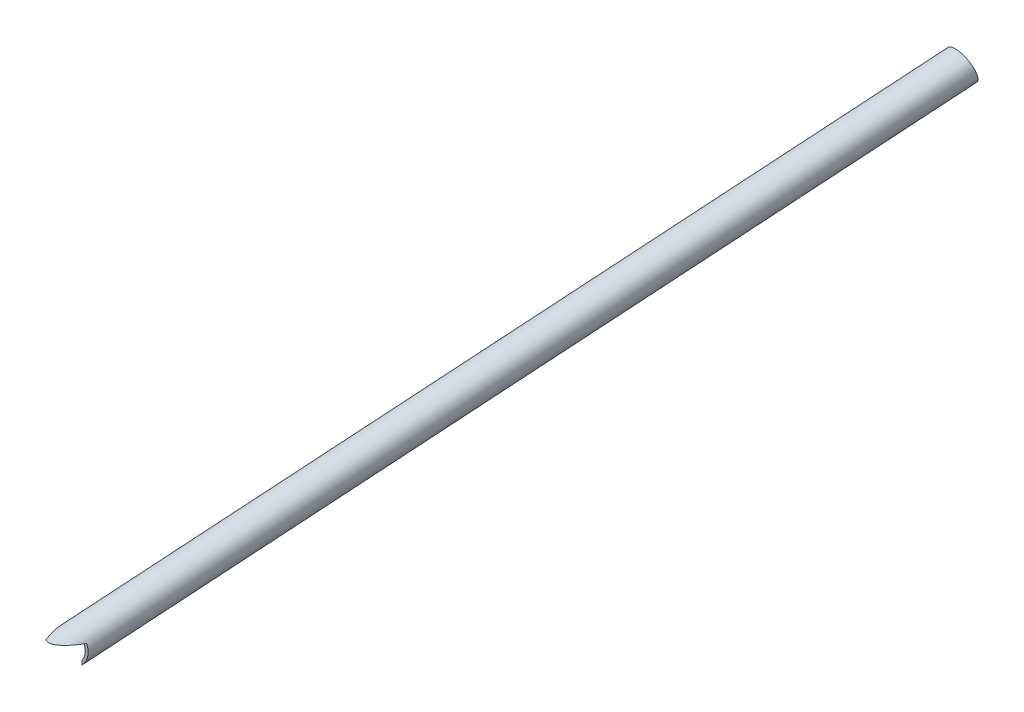
ISO-10303-21;
HEADER;
FILE_DESCRIPTION(('STEP AP214'),'2;1');
FILE_NAME('part.step','',(''),(''),'','','');
FILE_SCHEMA(('AUTOMOTIVE_DESIGN { 1 0 10303 214 1 1 1 1 }'));
ENDSEC;
DATA;
#1=APPLICATION_CONTEXT('core data for automotive mechanical design processes');
#2=APPLICATION_PROTOCOL_DEFINITION('international standard','automotive_design',2000,#1);
#3=PRODUCT_CONTEXT('',#1,'mechanical');
#4=PRODUCT('Part','Part','',(#3));
#5=PRODUCT_RELATED_PRODUCT_CATEGORY('part','',(#4));
#6=PRODUCT_DEFINITION_FORMATION('','',#4);
#7=PRODUCT_DEFINITION_CONTEXT('part definition',#1,'design');
#8=PRODUCT_DEFINITION('design','',#6,#7);
#9=PRODUCT_DEFINITION_SHAPE('','',#8);
#10=(LENGTH_UNIT() NAMED_UNIT(*) SI_UNIT(.MILLI.,.METRE.));
#11=(NAMED_UNIT(*) PLANE_ANGLE_UNIT() SI_UNIT($,.RADIAN.));
#12=(NAMED_UNIT(*) SI_UNIT($,.STERADIAN.) SOLID_ANGLE_UNIT());
#13=UNCERTAINTY_MEASURE_WITH_UNIT(LENGTH_MEASURE(1.E-05),#10,'distance_accuracy_value','');
#14=(GEOMETRIC_REPRESENTATION_CONTEXT(3) GLOBAL_UNCERTAINTY_ASSIGNED_CONTEXT((#13)) GLOBAL_UNIT_ASSIGNED_CONTEXT((#10,
#11,#12)) REPRESENTATION_CONTEXT('',''));
#15=CARTESIAN_POINT('',(0.,0.,0.));
#16=DIRECTION('',(0.,0.,1.));
#17=DIRECTION('',(1.,0.,0.));
#18=AXIS2_PLACEMENT_3D('',#15,#16,#17);
#19=CARTESIAN_POINT('',(-225.,200.,-200.));
#20=DIRECTION('',(0.313257210262409,0.388871019636094,-0.866400167535647));
#21=DIRECTION('',(0.,0.912318699307092,0.409480879766828));
#22=AXIS2_PLACEMENT_3D('',#19,#20,#21);
#23=CYLINDRICAL_SURFACE('',#22,7.9);
#24=CARTESIAN_POINT('',(-221.38438192881,204.488353467684,-210.));
#25=DIRECTION('',(0.,0.,1.));
#26=DIRECTION('',(0.627329537872645,0.778753909083283,0.));
#27=AXIS2_PLACEMENT_3D('',#24,#25,#26);
#28=ELLIPSE('',#27,9.11818844919022,7.9);
#29=CARTESIAN_POINT('',(-215.,199.831593159286,-210.));
#30=VERTEX_POINT('',#29);
#31=CARTESIAN_POINT('',(-214.223926995827,210.,-210.));
#32=VERTEX_POINT('',#31);
#33=EDGE_CURVE('E87',#30,#32,#28,.T.);
#34=ORIENTED_EDGE('',*,*,#33,.T.);
#35=CARTESIAN_POINT('',(-216.944444444444,210.,-222.279885200662));
#36=DIRECTION('',(0.,-1.,0.));
#37=DIRECTION('',(0.340019385805579,0.,-0.940418426699731));
#38=AXIS2_PLACEMENT_3D('',#35,#36,#37);
#39=ELLIPSE('',#38,20.3152191885958,7.9);
#40=CARTESIAN_POINT('',(-224.420881433489,210.,-203.449159749219));
#41=VERTEX_POINT('',#40);
#42=EDGE_CURVE('E58',#32,#41,#39,.T.);
#43=ORIENTED_EDGE('',*,*,#42,.T.);
#44=CARTESIAN_POINT('',(-223.15741407585,209.494665768298,-201.861286232763));
#45=CARTESIAN_POINT('',(-223.327974406081,209.562745738719,-202.012969265239));
#46=CARTESIAN_POINT('',(-223.488905143782,209.626944427415,-202.177273133402));
#47=CARTESIAN_POINT('',(-223.791864856838,209.748128840365,-202.525052642487));
#48=CARTESIAN_POINT('',(-223.933860733492,209.805101925764,-202.708560879475));
#49=CARTESIAN_POINT('',(-224.202084198849,209.912660789028,-203.090884440588));
#50=CARTESIAN_POINT('',(-224.328162850766,209.963186278447,-203.289819713302));
#51=CARTESIAN_POINT('',(-224.565793241595,210.057555962606,-203.697481360151));
#52=CARTESIAN_POINT('',(-224.677350123723,210.101402523783,-203.906204231962));
#53=CARTESIAN_POINT('',(-224.874517210087,210.17718743194,-204.302545574563));
#54=CARTESIAN_POINT('',(-224.961605595777,210.209933928598,-204.489284420906));
#55=CARTESIAN_POINT('',(-225.128243197558,210.270535558479,-204.866902084952));
#56=CARTESIAN_POINT('',(-225.207790896655,210.298389708443,-205.057781726226));
#57=CARTESIAN_POINT('',(-225.360531873015,210.349143618943,-205.44286743212));
#58=CARTESIAN_POINT('',(-225.433720346823,210.372039653504,-205.637075880849));
#59=CARTESIAN_POINT('',(-225.574605255814,210.412713683802,-206.028021785199));
#60=CARTESIAN_POINT('',(-225.642301057944,210.430491090198,-206.224759529311));
#61=CARTESIAN_POINT('',(-225.772850161109,210.460708569582,-206.620005490419));
#62=CARTESIAN_POINT('',(-225.83570849124,210.473154248712,-206.818511622636));
#63=CARTESIAN_POINT('',(-225.957233671713,210.492479216565,-207.217087974702));
#64=CARTESIAN_POINT('',(-226.01590016514,210.499358031809,-207.417158326133));
#65=CARTESIAN_POINT('',(-226.129437059783,210.507229691773,-207.81834829092));
#66=CARTESIAN_POINT('',(-226.184309936347,210.508226411098,-208.019467126208));
#67=CARTESIAN_POINT('',(-226.290629477458,210.503965117743,-208.42254371347));
#68=CARTESIAN_POINT('',(-226.342076037763,210.498706914856,-208.624501490769));
#69=CARTESIAN_POINT('',(-226.470812913115,210.476486415748,-209.146644744409));
#70=CARTESIAN_POINT('',(-226.545717299132,210.454493283931,-209.467228016284));
#71=CARTESIAN_POINT('',(-226.688135576776,210.391581478762,-210.108293160778));
#72=CARTESIAN_POINT('',(-226.755647653678,210.350658171095,-210.428774989328));
#73=CARTESIAN_POINT('',(-226.88318551129,210.247236082529,-211.066882200823));
#74=CARTESIAN_POINT('',(-226.943231403712,210.184797050782,-211.384513020718));
#75=CARTESIAN_POINT('',(-227.055662251596,210.034838645641,-212.015052089754));
#76=CARTESIAN_POINT('',(-227.108052412334,209.947336434132,-212.327963416731));
#77=CARTESIAN_POINT('',(-227.209205057179,209.732557526454,-212.976540123217));
#78=CARTESIAN_POINT('',(-227.257077223593,209.602172654149,-213.311341482179));
#79=CARTESIAN_POINT('',(-227.340526705393,209.298490783353,-213.96287870284));
#80=CARTESIAN_POINT('',(-227.376113972755,209.125228715901,-214.279629013146));
#81=CARTESIAN_POINT('',(-227.426142429048,208.769190109272,-214.819992523545));
#82=CARTESIAN_POINT('',(-227.443425831851,208.595680174492,-215.049371487169));
#83=CARTESIAN_POINT('',(-227.466260169275,208.21453962706,-215.478540418481));
#84=CARTESIAN_POINT('',(-227.471830524033,208.006966108684,-215.678378851741));
#85=CARTESIAN_POINT('',(-227.469678155462,207.59520199112,-216.008068509465));
#86=CARTESIAN_POINT('',(-227.463961777122,207.395905664675,-216.144012669458));
#87=CARTESIAN_POINT('',(-227.442562987403,206.978001992038,-216.38094169408));
#88=CARTESIAN_POINT('',(-227.426886380901,206.759405957675,-216.481946868424));
#89=CARTESIAN_POINT('',(-227.385919417368,206.309215765552,-216.645468005782));
#90=CARTESIAN_POINT('',(-227.360631160439,206.077624456615,-216.707992368865));
#91=CARTESIAN_POINT('',(-227.30157913635,205.608465167779,-216.79491824006));
#92=CARTESIAN_POINT('',(-227.267808448194,205.370892450642,-216.819288499405));
#93=CARTESIAN_POINT('',(-227.181282950598,204.819367462172,-216.835431093189));
#94=CARTESIAN_POINT('',(-227.125917576665,204.505476752567,-216.814165422459));
#95=CARTESIAN_POINT('',(-227.006237331831,203.886845601141,-216.722053584703));
#96=CARTESIAN_POINT('',(-226.941904338121,203.582125247281,-216.65110581589));
#97=CARTESIAN_POINT('',(-226.821041889938,203.049412135,-216.489738247));
#98=CARTESIAN_POINT('',(-226.765744490888,202.818835077272,-216.406622524923));
#99=CARTESIAN_POINT('',(-226.651774852837,202.36653896789,-216.220671171659));
#100=CARTESIAN_POINT('',(-226.593100571977,202.144825415872,-216.117823519814));
#101=CARTESIAN_POINT('',(-226.472751037479,201.710063822549,-215.895720879295));
#102=CARTESIAN_POINT('',(-226.411069469615,201.497035904644,-215.776430315131));
#103=CARTESIAN_POINT('',(-226.28504974538,201.079888985208,-215.524334572306));
#104=CARTESIAN_POINT('',(-226.220710623903,200.875773276549,-215.391524457837));
#105=CARTESIAN_POINT('',(-226.096880062015,200.498775780657,-215.130224660584));
#106=CARTESIAN_POINT('',(-226.037659740033,200.324966864671,-215.002935620688));
#107=CARTESIAN_POINT('',(-225.917163241838,199.983957879284,-214.740667265254));
#108=CARTESIAN_POINT('',(-225.855886743686,199.816758853821,-214.605686743108));
#109=CARTESIAN_POINT('',(-225.731130251102,199.48869541074,-214.328974776711));
#110=CARTESIAN_POINT('',(-225.667648744281,199.32783550917,-214.187238673058));
#111=CARTESIAN_POINT('',(-225.538320412779,199.012401106471,-213.897935161772));
#112=CARTESIAN_POINT('',(-225.472473273087,198.857827448312,-213.75036697727));
#113=CARTESIAN_POINT('',(-225.338141714108,198.554888492324,-213.450141487032));
#114=CARTESIAN_POINT('',(-225.269657204778,198.406523406829,-213.297484007564));
#115=CARTESIAN_POINT('',(-225.129686954206,198.115998592107,-212.987741281181));
#116=CARTESIAN_POINT('',(-225.058201525117,197.973838220594,-212.830656495346));
#117=CARTESIAN_POINT('',(-224.911778713593,197.69585221722,-212.51271795481));
#118=CARTESIAN_POINT('',(-224.83684334535,197.560022979961,-212.351866425553));
#119=CARTESIAN_POINT('',(-224.682866587882,197.294805557343,-212.026877908535));
#120=CARTESIAN_POINT('',(-224.603825600433,197.165416744143,-211.86274124322));
#121=CARTESIAN_POINT('',(-224.436786061511,196.907129602942,-211.523498171585));
#122=CARTESIAN_POINT('',(-224.348537543981,196.778575417702,-211.348252067001));
#123=CARTESIAN_POINT('',(-224.16548454257,196.529560758505,-210.995483522681));
#124=CARTESIAN_POINT('',(-224.070681338234,196.409098713877,-210.817961532701));
#125=CARTESIAN_POINT('',(-223.873085464909,196.177293680949,-210.461571387701));
#126=CARTESIAN_POINT('',(-223.770297792094,196.065945078209,-210.282704136752));
#127=CARTESIAN_POINT('',(-223.554863184149,195.853772251427,-209.924640484168));
#128=CARTESIAN_POINT('',(-223.442218498164,195.75294563796,-209.745444166708));
#129=CARTESIAN_POINT('',(-223.234626401174,195.587660603325,-209.432985571822));
#130=CARTESIAN_POINT('',(-223.142308980557,195.52041690198,-209.299455405871));
#131=CARTESIAN_POINT('',(-222.949943619699,195.3943239469,-209.033943945666));
#132=CARTESIAN_POINT('',(-222.849895474167,195.335474916205,-208.901962692652));
#133=CARTESIAN_POINT('',(-222.641443975575,195.227862081538,-208.640995227644));
#134=CARTESIAN_POINT('',(-222.533060294659,195.179075475351,-208.512002845316));
#135=CARTESIAN_POINT('',(-222.307186863994,195.093255768318,-208.258126637429));
#136=CARTESIAN_POINT('',(-222.189700347238,195.056218518124,-208.133241375415));
#137=CARTESIAN_POINT('',(-221.971439645239,195.002174997219,-207.914922414697));
#138=CARTESIAN_POINT('',(-221.872375764756,194.982590324942,-207.820416326994));
#139=CARTESIAN_POINT('',(-221.669003103014,194.952755953879,-207.63568451151));
#140=CARTESIAN_POINT('',(-221.564695576393,194.942504033175,-207.545457769765));
#141=CARTESIAN_POINT('',(-221.351608787199,194.931970535455,-207.369936486675));
#142=CARTESIAN_POINT('',(-221.242831854888,194.931683827186,-207.284639429545));
#143=CARTESIAN_POINT('',(-221.021788289261,194.941400110647,-207.119309538873));
#144=CARTESIAN_POINT('',(-220.9095215108,194.95140353091,-207.039276924717));
#145=CARTESIAN_POINT('',(-220.6830512334,194.98165198554,-206.884793232691));
#146=CARTESIAN_POINT('',(-220.568854297072,195.001867227309,-206.810326637569));
#147=CARTESIAN_POINT('',(-220.33944988945,195.052223836627,-206.666513379757));
#148=CARTESIAN_POINT('',(-220.224242412263,195.082365262108,-206.597166746949));
#149=CARTESIAN_POINT('',(-219.993790923522,195.152124881836,-206.463048150085));
#150=CARTESIAN_POINT('',(-219.878547146444,195.191758105128,-206.398283654075));
#151=CARTESIAN_POINT('',(-219.649197891393,195.279864179176,-206.272854501397));
#152=CARTESIAN_POINT('',(-219.535092738681,195.328339483602,-206.212190989169));
#153=CARTESIAN_POINT('',(-219.257576496114,195.457333029769,-206.067585253041));
#154=CARTESIAN_POINT('',(-219.095274118385,195.542412800202,-205.985563401102));
#155=CARTESIAN_POINT('',(-218.776971131237,195.727974790128,-205.826860147979));
#156=CARTESIAN_POINT('',(-218.620973134161,195.828463313506,-205.750180951291));
#157=CARTESIAN_POINT('',(-218.316732659703,196.043239005076,-205.600369678967));
#158=CARTESIAN_POINT('',(-218.16849809937,196.157539880748,-205.527241229669));
#159=CARTESIAN_POINT('',(-217.88120493768,196.39839831081,-205.383169131196));
#160=CARTESIAN_POINT('',(-217.742147283191,196.524957126653,-205.312225707872));
#161=CARTESIAN_POINT('',(-217.47104442082,196.792238551892,-205.16967914951));
#162=CARTESIAN_POINT('',(-217.339251014934,196.933230194536,-205.098101730693));
#163=CARTESIAN_POINT('',(-217.087462372493,197.2254598636,-204.95511121498));
#164=CARTESIAN_POINT('',(-216.96746732582,197.376698054861,-204.883698120747));
#165=CARTESIAN_POINT('',(-216.740269714126,197.688188770664,-204.740379001976));
#166=CARTESIAN_POINT('',(-216.633062683641,197.848438119658,-204.668473158831));
#167=CARTESIAN_POINT('',(-216.432287564364,198.176839087151,-204.52368241459));
#168=CARTESIAN_POINT('',(-216.338719270829,198.344990586976,-204.450797528209));
#169=CARTESIAN_POINT('',(-216.156777932211,198.706456120528,-204.29587281104));
#170=CARTESIAN_POINT('',(-216.070038623282,198.900534546055,-204.213689544825));
#171=CARTESIAN_POINT('',(-215.91530453798,199.295348441643,-204.04762640718));
#172=CARTESIAN_POINT('',(-215.847311173235,199.496084411763,-203.96374640849));
#173=CARTESIAN_POINT('',(-215.730932265591,199.902515605058,-203.794368539942));
#174=CARTESIAN_POINT('',(-215.68254733055,200.108210981765,-203.708870620014));
#175=CARTESIAN_POINT('',(-215.606060390176,200.52278246883,-203.536536081388));
#176=CARTESIAN_POINT('',(-215.577957033119,200.731658366267,-203.4496995523));
#177=CARTESIAN_POINT('',(-215.543340986324,201.140432778622,-203.279445596998));
#178=CARTESIAN_POINT('',(-215.535830449981,201.34026513683,-203.196071138344));
#179=CARTESIAN_POINT('',(-215.539682946782,201.73962086627,-203.029022125265));
#180=CARTESIAN_POINT('',(-215.551045424227,201.939144246427,-202.945347579748));
#181=CARTESIAN_POINT('',(-215.592573327759,202.336318709402,-202.778326520772));
#182=CARTESIAN_POINT('',(-215.622735400207,202.533970119776,-202.694979951474));
#183=CARTESIAN_POINT('',(-215.701568806861,202.925976046154,-202.52930186635));
#184=CARTESIAN_POINT('',(-215.750239943658,203.120330597298,-202.446970339709));
#185=CARTESIAN_POINT('',(-215.863804572901,203.498450989391,-202.286616489956));
#186=CARTESIAN_POINT('',(-215.928150775406,203.682358483184,-202.208539605136));
#187=CARTESIAN_POINT('',(-216.073123953725,204.044687230107,-202.054835978459));
#188=CARTESIAN_POINT('',(-216.153750491643,204.223108630649,-201.979209170765));
#189=CARTESIAN_POINT('',(-216.330501234903,204.573463596592,-201.831238489228));
#190=CARTESIAN_POINT('',(-216.426622495393,204.745398387161,-201.758893994906));
#191=CARTESIAN_POINT('',(-216.633496436452,205.082004151423,-201.618350883464));
#192=CARTESIAN_POINT('',(-216.744249564941,205.246674902539,-201.550152393357));
#193=CARTESIAN_POINT('',(-216.983229903197,205.573297796003,-201.416731456827));
#194=CARTESIAN_POINT('',(-217.111906561117,205.734989572436,-201.351676704889));
#195=CARTESIAN_POINT('',(-217.382694169538,206.049393476437,-201.228166234611));
#196=CARTESIAN_POINT('',(-217.524805521934,206.202105335152,-201.169710713799));
#197=CARTESIAN_POINT('',(-217.821544173805,206.49846812798,-201.060620550982));
#198=CARTESIAN_POINT('',(-217.976194403955,206.642101565818,-201.010000753731));
#199=CARTESIAN_POINT('',(-218.296505872166,206.919812650992,-200.918270585676));
#200=CARTESIAN_POINT('',(-218.462167187964,207.05389023085,-200.877160282018));
#201=CARTESIAN_POINT('',(-218.812470927996,207.319564559755,-200.80436821664));
#202=CARTESIAN_POINT('',(-218.99765599785,207.450623371202,-200.773326065643));
#203=CARTESIAN_POINT('',(-219.376959822801,207.702310836852,-200.726558291976));
#204=CARTESIAN_POINT('',(-219.57108115867,207.822936448647,-200.710837123401));
#205=CARTESIAN_POINT('',(-219.965281186632,208.053700174132,-200.698013095305));
#206=CARTESIAN_POINT('',(-220.165338920172,208.163870487332,-200.700851056921));
#207=CARTESIAN_POINT('',(-220.568888598542,208.374584569381,-200.728813702706));
#208=CARTESIAN_POINT('',(-220.772377324186,208.475136829215,-200.753918524323));
#209=CARTESIAN_POINT('',(-221.101022026061,208.630498293655,-200.81565692272));
#210=CARTESIAN_POINT('',(-221.226399658318,208.688105308887,-200.844220107541));
#211=CARTESIAN_POINT('',(-221.475700205106,208.800011237156,-200.912080050722));
#212=CARTESIAN_POINT('',(-221.599623613148,208.854311300299,-200.951373051044));
#213=CARTESIAN_POINT('',(-221.844522313544,208.959647336043,-201.041131092977));
#214=CARTESIAN_POINT('',(-221.965502243009,209.010688680509,-201.091577102569));
#215=CARTESIAN_POINT('',(-222.203367318799,209.109701585333,-201.203766435687));
#216=CARTESIAN_POINT('',(-222.320253655822,209.157674041749,-201.265506441073));
#217=CARTESIAN_POINT('',(-222.562396763165,209.256210635006,-201.407957815532));
#218=CARTESIAN_POINT('',(-222.686993571193,209.306403473372,-201.49005265607));
#219=CARTESIAN_POINT('',(-222.928256144755,209.403179938807,-201.666705170069));
#220=CARTESIAN_POINT('',(-223.044929269011,209.449766920412,-201.761251033572));
#221=CARTESIAN_POINT('',(-223.15741407585,209.494665768298,-201.861286232763));
#222=B_SPLINE_CURVE_WITH_KNOTS('',3,(#44,#45,#46,#47,#48,#49,#50,#51,#52,#53,#54,#55,#56,#57,
#58,#59,#60,#61,#62,#63,#64,#65,#66,#67,#68,#69,#70,#71,#72,#73,#74,#75,#76,#77,#78,#79,#80,#81,
#82,#83,#84,#85,#86,#87,#88,#89,#90,#91,#92,#93,#94,#95,#96,#97,#98,#99,#100,#101,#102,#103,
#104,#105,#106,#107,#108,#109,#110,#111,#112,#113,#114,#115,#116,#117,#118,#119,#120,#121,#122,
#123,#124,#125,#126,#127,#128,#129,#130,#131,#132,#133,#134,#135,#136,#137,#138,#139,#140,#141,
#142,#143,#144,#145,#146,#147,#148,#149,#150,#151,#152,#153,#154,#155,#156,#157,#158,#159,#160,
#161,#162,#163,#164,#165,#166,#167,#168,#169,#170,#171,#172,#173,#174,#175,#176,#177,#178,#179,
#180,#181,#182,#183,#184,#185,#186,#187,#188,#189,#190,#191,#192,#193,#194,#195,#196,#197,#198,
#199,#200,#201,#202,#203,#204,#205,#206,#207,#208,#209,#210,#211,#212,#213,#214,#215,#216,#217,
#218,#219,#220,#221),.UNSPECIFIED.,.T.,.F.,(4,2,2,2,2,2,2,2,2,2,2,2,2,2,2,2,2,2,2,2,2,2,2,2,2,2,
2,2,2,2,2,2,2,2,2,2,2,2,2,2,2,2,2,2,2,2,2,2,2,2,2,2,2,2,2,2,2,2,2,2,2,2,2,2,2,2,2,2,2,2,2,2,2,2,
2,2,2,2,2,2,2,2,2,2,2,2,2,2,4),(0.,0.714245117726528,1.42972283287113,2.15146461168783,
2.87295006959634,3.49859524560453,4.12436601952793,4.75060543445332,5.37691692365076,
6.00256824013819,6.62827276458423,7.25356508423245,7.87887641897251,8.86813382212596,
9.85763353455121,10.8444072608655,11.8305069076748,12.915471327956,13.9995547464464,
14.860933162671,15.7208822908643,16.4415904151807,17.1618788915934,17.8820100786787,
18.602730755725,19.5557423548166,20.5107086123729,21.2634662633571,22.0166839576078,
22.7715576512422,23.5267079344591,24.1967322720754,24.8668620112123,25.5374608305523,
26.2081492808802,26.8788606499087,27.5495024241156,28.2197575008868,28.8899471098572,
29.5934533549845,30.296822653839,30.9997553201658,31.7025280093608,32.2293527735402,
32.7561915325002,33.2818229904584,33.8072686117137,34.2217495148684,34.6361317135868,
35.0503005368926,35.4644866089923,35.8774712282359,36.2904582577536,36.7041035735794,
37.1178638507462,37.7192784026026,38.3209396592186,38.9232029895974,39.5255283642989,
40.1424590597949,40.7593996824583,41.3761242402754,41.992839539014,42.6757041587882,
43.3586201863731,44.0415573826616,44.7244490584866,45.3736113319629,46.0227544918234,
46.6717818849349,47.3208023560699,47.9497833687377,48.578747465844,49.2075921656426,
49.8364561204631,50.4856679279792,51.1348991626077,51.7853456949964,52.4357968200235,
53.1218679578875,53.8081384899486,54.4922218040387,55.1756955131237,55.5980152450925,
56.020187252084,56.441644330344,56.8629777841826,57.334467601877,57.8055133837074),.UNSPECIFIED.);
#223=CARTESIAN_POINT('',(-227.0734472286,210.,-212.126605746777));
#224=VERTEX_POINT('',#223);
#225=EDGE_CURVE('E107',#41,#224,#222,.T.);
#226=ORIENTED_EDGE('',*,*,#225,.T.);
#227=CARTESIAN_POINT('',(-215.,210.,-239.923532285983));
#228=VERTEX_POINT('',#227);
#229=EDGE_CURVE('E96',#224,#228,#39,.T.);
#230=ORIENTED_EDGE('',*,*,#229,.T.);
#231=CARTESIAN_POINT('',(-215.,212.413793103448,-227.65778852496));
#232=DIRECTION('',(-1.,0.,0.));
#233=DIRECTION('',(0.,0.409480879766828,-0.912318699307092));
#234=AXIS2_PLACEMENT_3D('',#231,#232,#233);
#235=ELLIPSE('',#234,25.2188927858431,7.9);
#236=EDGE_CURVE('E106',#228,#30,#235,.T.);
#237=ORIENTED_EDGE('',*,*,#236,.T.);
#238=EDGE_LOOP('',(#34,#43,#226,#230,#237));
#239=FACE_BOUND('',#238,.T.);
#240=CARTESIAN_POINT('',(-80.,380.,-601.037933611912));
#241=DIRECTION('',(0.0877040448988902,0.311824264686694,-0.946083309471728));
#242=DIRECTION('',(0.915766996856784,0.348518707826595,0.199763654759287));
#243=AXIS2_PLACEMENT_3D('',#240,#241,#242);
#244=ELLIPSE('',#243,8.15761687173193,7.9);
#245=CARTESIAN_POINT('',(-72.5295236958659,382.84308209108,-599.408338251489));
#246=VERTEX_POINT('',#245);
#247=EDGE_CURVE('E45',#246,#246,#244,.T.);
#248=ORIENTED_EDGE('',*,*,#247,.T.);
#249=EDGE_LOOP('',(#248));
#250=FACE_BOUND('',#249,.T.);
#251=ADVANCED_FACE('F41',(#239,#250),#23,.F.);
#252=CARTESIAN_POINT('',(-225.,200.,-200.));
#253=DIRECTION('',(0.313257210262409,0.388871019636094,-0.866400167535647));
#254=DIRECTION('',(0.,0.912318699307092,0.409480879766828));
#255=AXIS2_PLACEMENT_3D('',#252,#253,#254);
#256=CYLINDRICAL_SURFACE('',#255,9.5);
#257=CARTESIAN_POINT('',(-216.944444444444,210.,-222.279885200662));
#258=DIRECTION('',(0.,-1.,0.));
#259=DIRECTION('',(0.340019385805579,0.,-0.940418426699731));
#260=AXIS2_PLACEMENT_3D('',#257,#258,#259);
#261=ELLIPSE('',#260,24.4296939609696,9.5);
#262=CARTESIAN_POINT('',(-212.152625115666,210.,-210.));
#263=VERTEX_POINT('',#262);
#264=CARTESIAN_POINT('',(-226.408415127519,210.,-199.974629586691));
#265=VERTEX_POINT('',#264);
#266=EDGE_CURVE('E50',#263,#265,#261,.T.);
#267=ORIENTED_EDGE('',*,*,#266,.F.);
#268=CARTESIAN_POINT('',(-221.38438192881,204.488353467684,-210.));
#269=DIRECTION('',(0.,0.,1.));
#270=DIRECTION('',(0.627329537872645,0.778753909083283,0.));
#271=AXIS2_PLACEMENT_3D('',#268,#269,#270);
#272=ELLIPSE('',#271,10.9649101604186,9.5);
#273=CARTESIAN_POINT('',(-215.,197.413463504428,-210.));
#274=VERTEX_POINT('',#273);
#275=EDGE_CURVE('E83',#274,#263,#272,.T.);
#276=ORIENTED_EDGE('',*,*,#275,.F.);
#277=CARTESIAN_POINT('',(-215.,212.413793103448,-227.65778852496));
#278=DIRECTION('',(-1.,0.,0.));
#279=DIRECTION('',(0.,0.409480879766828,-0.912318699307092));
#280=AXIS2_PLACEMENT_3D('',#277,#278,#279);
#281=ELLIPSE('',#280,30.3265166412037,9.5);
#282=CARTESIAN_POINT('',(-215.,210.,-243.177807236863));
#283=VERTEX_POINT('',#282);
#284=EDGE_CURVE('E170',#283,#274,#281,.T.);
#285=ORIENTED_EDGE('',*,*,#284,.F.);
#286=CARTESIAN_POINT('',(-228.616604705313,210.,-215.105762164605));
#287=VERTEX_POINT('',#286);
#288=EDGE_CURVE('E167',#287,#283,#261,.T.);
#289=ORIENTED_EDGE('',*,*,#288,.F.);
#290=CARTESIAN_POINT('',(-225.,200.,-200.));
#291=DIRECTION('',(0.979997411230481,0.1383871597552,-0.143017719169493));
#292=DIRECTION('',(-0.18494238420669,0.367901037751926,-0.911287627999525));
#293=AXIS2_PLACEMENT_3D('',#290,#291,#292);
#294=ELLIPSE('',#293,19.5990817258114,9.5);
#295=EDGE_CURVE('E114',#265,#287,#294,.F.);
#296=ORIENTED_EDGE('',*,*,#295,.F.);
#297=EDGE_LOOP('',(#267,#276,#285,#289,#296));
#298=FACE_BOUND('',#297,.T.);
#299=CARTESIAN_POINT('',(-80.,380.,-601.037933611912));
#300=DIRECTION('',(0.0877040448988902,0.311824264686694,-0.946083309471728));
#301=DIRECTION('',(0.915766996856784,0.348518707826595,0.199763654759287));
#302=AXIS2_PLACEMENT_3D('',#299,#300,#301);
#303=ELLIPSE('',#302,9.80979244069028,9.5);
#304=CARTESIAN_POINT('',(-71.0165158368007,383.418896185476,-599.07829362153));
#305=VERTEX_POINT('',#304);
#306=EDGE_CURVE('E11',#305,#305,#303,.T.);
#307=ORIENTED_EDGE('',*,*,#306,.F.);
#308=EDGE_LOOP('',(#307));
#309=FACE_BOUND('',#308,.T.);
#310=ADVANCED_FACE('F132',(#298,#309),#256,.T.);
#311=CARTESIAN_POINT('',(-225.,200.,-200.));
#312=DIRECTION('',(0.636784790371592,-0.254713916148637,0.727754046138963));
#313=DIRECTION('',(0.752576694706878,0.,-0.658504607868518));
#314=AXIS2_PLACEMENT_3D('',#311,#312,#313);
#315=CYLINDRICAL_SURFACE('',#314,9.5);
#316=ORIENTED_EDGE('',*,*,#295,.T.);
#317=CARTESIAN_POINT('',(-250.,210.,-228.571428571429));
#318=DIRECTION('',(0.,-1.,0.));
#319=DIRECTION('',(0.658504607868518,0.,0.752576694706878));
#320=AXIS2_PLACEMENT_3D('',#317,#318,#319);
#321=ELLIPSE('',#320,37.2967450842235,9.5);
#322=EDGE_CURVE('E99',#287,#224,#321,.T.);
#323=ORIENTED_EDGE('',*,*,#322,.T.);
#324=ORIENTED_EDGE('',*,*,#225,.F.);
#325=EDGE_CURVE('E64',#41,#265,#321,.T.);
#326=ORIENTED_EDGE('',*,*,#325,.T.);
#327=EDGE_LOOP('',(#316,#323,#324,#326));
#328=FACE_BOUND('',#327,.T.);
#329=ADVANCED_FACE('F112',(#328),#315,.F.);
#330=CARTESIAN_POINT('',(-225.,190.,-210.));
#331=DIRECTION('',(0.,0.,1.));
#332=DIRECTION('',(1.,0.,0.));
#333=AXIS2_PLACEMENT_3D('',#330,#331,#332);
#334=PLANE('',#333);
#335=DIRECTION('',(0.,-1.,0.));
#336=VECTOR('',#335,1.);
#337=CARTESIAN_POINT('',(-215.,190.,-210.));
#338=LINE('',#337,#336);
#339=EDGE_CURVE('E169',#30,#274,#338,.T.);
#340=ORIENTED_EDGE('',*,*,#339,.T.);
#341=ORIENTED_EDGE('',*,*,#275,.T.);
#342=DIRECTION('',(1.,0.,0.));
#343=VECTOR('',#342,1.);
#344=CARTESIAN_POINT('',(-225.,210.,-210.));
#345=LINE('',#344,#343);
#346=EDGE_CURVE('E166',#32,#263,#345,.T.);
#347=ORIENTED_EDGE('',*,*,#346,.F.);
#348=ORIENTED_EDGE('',*,*,#33,.F.);
#349=EDGE_LOOP('',(#340,#341,#347,#348));
#350=FACE_BOUND('',#349,.T.);
#351=ADVANCED_FACE('F131',(#350),#334,.T.);
#352=CARTESIAN_POINT('',(-215.,190.,-450.));
#353=DIRECTION('',(-1.,0.,0.));
#354=DIRECTION('',(0.,0.,1.));
#355=AXIS2_PLACEMENT_3D('',#352,#353,#354);
#356=PLANE('',#355);
#357=DIRECTION('',(0.,0.,1.));
#358=VECTOR('',#357,1.);
#359=CARTESIAN_POINT('',(-215.,210.,-450.));
#360=LINE('',#359,#358);
#361=EDGE_CURVE('E102',#283,#228,#360,.T.);
#362=ORIENTED_EDGE('',*,*,#361,.F.);
#363=ORIENTED_EDGE('',*,*,#284,.T.);
#364=ORIENTED_EDGE('',*,*,#339,.F.);
#365=ORIENTED_EDGE('',*,*,#236,.F.);
#366=EDGE_LOOP('',(#362,#363,#364,#365));
#367=FACE_BOUND('',#366,.T.);
#368=ADVANCED_FACE('F135',(#367),#356,.T.);
#369=CARTESIAN_POINT('',(-225.,210.,-190.));
#370=DIRECTION('',(0.,-1.,0.));
#371=DIRECTION('',(0.,0.,-1.));
#372=AXIS2_PLACEMENT_3D('',#369,#370,#371);
#373=PLANE('',#372);
#374=ORIENTED_EDGE('',*,*,#322,.F.);
#375=ORIENTED_EDGE('',*,*,#288,.T.);
#376=ORIENTED_EDGE('',*,*,#361,.T.);
#377=ORIENTED_EDGE('',*,*,#229,.F.);
#378=EDGE_LOOP('',(#374,#375,#376,#377));
#379=FACE_BOUND('',#378,.T.);
#380=ADVANCED_FACE('F98',(#379),#373,.T.);
#381=ORIENTED_EDGE('',*,*,#346,.T.);
#382=ORIENTED_EDGE('',*,*,#266,.T.);
#383=ORIENTED_EDGE('',*,*,#325,.F.);
#384=ORIENTED_EDGE('',*,*,#42,.F.);
#385=EDGE_LOOP('',(#381,#382,#383,#384));
#386=FACE_BOUND('',#385,.T.);
#387=ADVANCED_FACE('F136',(#386),#373,.T.);
#388=CARTESIAN_POINT('',(-80.,380.,-601.037933611912));
#389=DIRECTION('',(0.0877040448988902,0.311824264686694,-0.946083309471728));
#390=DIRECTION('',(0.,0.949743072396233,0.313030504001389));
#391=AXIS2_PLACEMENT_3D('',#388,#389,#390);
#392=PLANE('',#391);
#393=ORIENTED_EDGE('',*,*,#247,.F.);
#394=EDGE_LOOP('',(#393));
#395=FACE_BOUND('',#394,.T.);
#396=ORIENTED_EDGE('',*,*,#306,.T.);
#397=EDGE_LOOP('',(#396));
#398=FACE_BOUND('',#397,.T.);
#399=ADVANCED_FACE('F43',(#395,#398),#392,.T.);
#400=CLOSED_SHELL('',(#251,#310,#329,#351,#368,#380,#387,#399));
#401=MANIFOLD_SOLID_BREP('B2',#400);
#402=ADVANCED_BREP_SHAPE_REPRESENTATION('',(#18,#401),#14);
#403=SHAPE_DEFINITION_REPRESENTATION(#9,#402);
ENDSEC;
END-ISO-10303-21;
